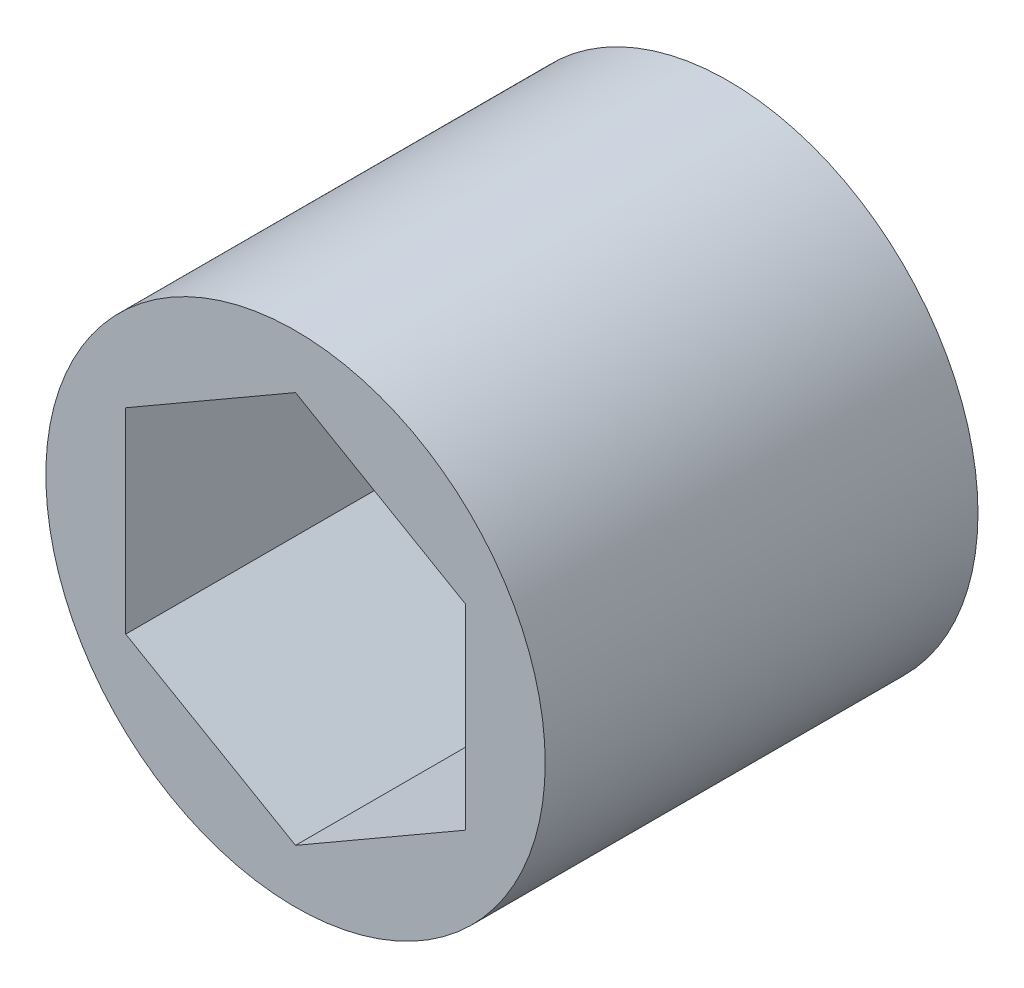
ISO-10303-21;
HEADER;
FILE_DESCRIPTION(('STEP AP214'),'2;1');
FILE_NAME('part.step','',(''),(''),'','','');
FILE_SCHEMA(('AUTOMOTIVE_DESIGN { 1 0 10303 214 1 1 1 1 }'));
ENDSEC;
DATA;
#1=APPLICATION_CONTEXT('core data for automotive mechanical design processes');
#2=APPLICATION_PROTOCOL_DEFINITION('international standard','automotive_design',2000,#1);
#3=PRODUCT_CONTEXT('',#1,'mechanical');
#4=PRODUCT('Part','Part','',(#3));
#5=PRODUCT_RELATED_PRODUCT_CATEGORY('part','',(#4));
#6=PRODUCT_DEFINITION_FORMATION('','',#4);
#7=PRODUCT_DEFINITION_CONTEXT('part definition',#1,'design');
#8=PRODUCT_DEFINITION('design','',#6,#7);
#9=PRODUCT_DEFINITION_SHAPE('','',#8);
#10=(LENGTH_UNIT() NAMED_UNIT(*) SI_UNIT(.MILLI.,.METRE.));
#11=(NAMED_UNIT(*) PLANE_ANGLE_UNIT() SI_UNIT($,.RADIAN.));
#12=(NAMED_UNIT(*) SI_UNIT($,.STERADIAN.) SOLID_ANGLE_UNIT());
#13=UNCERTAINTY_MEASURE_WITH_UNIT(LENGTH_MEASURE(1.E-05),#10,'distance_accuracy_value','');
#14=(GEOMETRIC_REPRESENTATION_CONTEXT(3) GLOBAL_UNCERTAINTY_ASSIGNED_CONTEXT((#13)) GLOBAL_UNIT_ASSIGNED_CONTEXT((#10,
#11,#12)) REPRESENTATION_CONTEXT('',''));
#15=CARTESIAN_POINT('',(0.,0.,0.));
#16=DIRECTION('',(0.,0.,1.));
#17=DIRECTION('',(1.,0.,0.));
#18=AXIS2_PLACEMENT_3D('',#15,#16,#17);
#19=CARTESIAN_POINT('',(0.,0.,8.255));
#20=DIRECTION('',(0.,0.,1.));
#21=DIRECTION('',(1.,0.,0.));
#22=AXIS2_PLACEMENT_3D('',#19,#20,#21);
#23=PLANE('',#22);
#24=CARTESIAN_POINT('',(0.,0.,8.255));
#25=DIRECTION('',(0.,0.,1.));
#26=DIRECTION('',(1.,0.,0.));
#27=AXIS2_PLACEMENT_3D('',#24,#25,#26);
#28=CIRCLE('',#27,9.525);
#29=CARTESIAN_POINT('',(9.525,0.,8.255));
#30=VERTEX_POINT('',#29);
#31=EDGE_CURVE('E11',#30,#30,#28,.T.);
#32=ORIENTED_EDGE('',*,*,#31,.T.);
#33=EDGE_LOOP('',(#32));
#34=FACE_BOUND('',#33,.T.);
#35=DIRECTION('',(-0.866025403784439,-0.5,0.));
#36=VECTOR('',#35,1.);
#37=CARTESIAN_POINT('',(0.,7.47899538708241,8.255));
#38=LINE('',#37,#36);
#39=CARTESIAN_POINT('',(0.,7.47899538708241,8.255));
#40=VERTEX_POINT('',#39);
#41=CARTESIAN_POINT('',(-6.477,3.73949769354121,8.255));
#42=VERTEX_POINT('',#41);
#43=EDGE_CURVE('E108',#40,#42,#38,.T.);
#44=ORIENTED_EDGE('',*,*,#43,.F.);
#45=DIRECTION('',(-0.866025403784439,0.5,0.));
#46=VECTOR('',#45,1.);
#47=CARTESIAN_POINT('',(6.477,3.73949769354121,8.255));
#48=LINE('',#47,#46);
#49=CARTESIAN_POINT('',(6.477,3.73949769354121,8.255));
#50=VERTEX_POINT('',#49);
#51=EDGE_CURVE('E99',#50,#40,#48,.T.);
#52=ORIENTED_EDGE('',*,*,#51,.F.);
#53=DIRECTION('',(0.,1.,0.));
#54=VECTOR('',#53,1.);
#55=CARTESIAN_POINT('',(6.47699999999999,-3.73949769354121,8.255));
#56=LINE('',#55,#54);
#57=CARTESIAN_POINT('',(6.47699999999999,-3.73949769354121,8.255));
#58=VERTEX_POINT('',#57);
#59=EDGE_CURVE('E133',#58,#50,#56,.T.);
#60=ORIENTED_EDGE('',*,*,#59,.F.);
#61=DIRECTION('',(0.866025403784439,0.5,0.));
#62=VECTOR('',#61,1.);
#63=CARTESIAN_POINT('',(0.,-7.47899538708241,8.255));
#64=LINE('',#63,#62);
#65=CARTESIAN_POINT('',(0.,-7.47899538708241,8.255));
#66=VERTEX_POINT('',#65);
#67=EDGE_CURVE('E130',#66,#58,#64,.T.);
#68=ORIENTED_EDGE('',*,*,#67,.F.);
#69=DIRECTION('',(0.866025403784438,-0.5,0.));
#70=VECTOR('',#69,1.);
#71=CARTESIAN_POINT('',(-6.477,-3.7394976935412,8.255));
#72=LINE('',#71,#70);
#73=CARTESIAN_POINT('',(-6.477,-3.7394976935412,8.255));
#74=VERTEX_POINT('',#73);
#75=EDGE_CURVE('E125',#74,#66,#72,.T.);
#76=ORIENTED_EDGE('',*,*,#75,.F.);
#77=DIRECTION('',(0.,-1.,0.));
#78=VECTOR('',#77,1.);
#79=CARTESIAN_POINT('',(-6.477,3.73949769354121,8.255));
#80=LINE('',#79,#78);
#81=EDGE_CURVE('E121',#42,#74,#80,.T.);
#82=ORIENTED_EDGE('',*,*,#81,.F.);
#83=EDGE_LOOP('',(#44,#52,#60,#68,#76,#82));
#84=FACE_BOUND('',#83,.T.);
#85=ADVANCED_FACE('F45',(#34,#84),#23,.T.);
#86=CARTESIAN_POINT('',(0.,0.,-8.255));
#87=DIRECTION('',(0.,0.,1.));
#88=DIRECTION('',(1.,0.,0.));
#89=AXIS2_PLACEMENT_3D('',#86,#87,#88);
#90=PLANE('',#89);
#91=CARTESIAN_POINT('',(0.,0.,-8.255));
#92=DIRECTION('',(0.,0.,1.));
#93=DIRECTION('',(1.,0.,0.));
#94=AXIS2_PLACEMENT_3D('',#91,#92,#93);
#95=CIRCLE('',#94,9.525);
#96=CARTESIAN_POINT('',(9.525,0.,-8.255));
#97=VERTEX_POINT('',#96);
#98=EDGE_CURVE('E49',#97,#97,#95,.T.);
#99=ORIENTED_EDGE('',*,*,#98,.F.);
#100=EDGE_LOOP('',(#99));
#101=FACE_BOUND('',#100,.T.);
#102=DIRECTION('',(-0.866025403784439,0.5,0.));
#103=VECTOR('',#102,1.);
#104=CARTESIAN_POINT('',(6.477,3.73949769354121,-8.255));
#105=LINE('',#104,#103);
#106=CARTESIAN_POINT('',(6.477,3.73949769354121,-8.255));
#107=VERTEX_POINT('',#106);
#108=CARTESIAN_POINT('',(0.,7.47899538708241,-8.255));
#109=VERTEX_POINT('',#108);
#110=EDGE_CURVE('E69',#107,#109,#105,.T.);
#111=ORIENTED_EDGE('',*,*,#110,.T.);
#112=DIRECTION('',(-0.866025403784439,-0.5,0.));
#113=VECTOR('',#112,1.);
#114=CARTESIAN_POINT('',(0.,7.47899538708241,-8.255));
#115=LINE('',#114,#113);
#116=CARTESIAN_POINT('',(-6.477,3.73949769354121,-8.255));
#117=VERTEX_POINT('',#116);
#118=EDGE_CURVE('E115',#109,#117,#115,.T.);
#119=ORIENTED_EDGE('',*,*,#118,.T.);
#120=DIRECTION('',(0.,-1.,0.));
#121=VECTOR('',#120,1.);
#122=CARTESIAN_POINT('',(-6.477,3.73949769354121,-8.255));
#123=LINE('',#122,#121);
#124=CARTESIAN_POINT('',(-6.477,-3.7394976935412,-8.255));
#125=VERTEX_POINT('',#124);
#126=EDGE_CURVE('E140',#117,#125,#123,.T.);
#127=ORIENTED_EDGE('',*,*,#126,.T.);
#128=DIRECTION('',(0.866025403784438,-0.5,0.));
#129=VECTOR('',#128,1.);
#130=CARTESIAN_POINT('',(-6.477,-3.7394976935412,-8.255));
#131=LINE('',#130,#129);
#132=CARTESIAN_POINT('',(0.,-7.47899538708241,-8.255));
#133=VERTEX_POINT('',#132);
#134=EDGE_CURVE('E144',#125,#133,#131,.T.);
#135=ORIENTED_EDGE('',*,*,#134,.T.);
#136=DIRECTION('',(0.866025403784439,0.5,0.));
#137=VECTOR('',#136,1.);
#138=CARTESIAN_POINT('',(0.,-7.47899538708241,-8.255));
#139=LINE('',#138,#137);
#140=CARTESIAN_POINT('',(6.47699999999999,-3.73949769354121,-8.255));
#141=VERTEX_POINT('',#140);
#142=EDGE_CURVE('E148',#133,#141,#139,.T.);
#143=ORIENTED_EDGE('',*,*,#142,.T.);
#144=DIRECTION('',(0.,1.,0.));
#145=VECTOR('',#144,1.);
#146=CARTESIAN_POINT('',(6.47699999999999,-3.73949769354121,-8.255));
#147=LINE('',#146,#145);
#148=EDGE_CURVE('E109',#141,#107,#147,.T.);
#149=ORIENTED_EDGE('',*,*,#148,.T.);
#150=EDGE_LOOP('',(#111,#119,#127,#135,#143,#149));
#151=FACE_BOUND('',#150,.T.);
#152=ADVANCED_FACE('F172',(#101,#151),#90,.F.);
#153=CARTESIAN_POINT('',(0.,0.,8.255));
#154=DIRECTION('',(0.,0.,-1.));
#155=DIRECTION('',(-1.,0.,0.));
#156=AXIS2_PLACEMENT_3D('',#153,#154,#155);
#157=CYLINDRICAL_SURFACE('',#156,9.525);
#158=ORIENTED_EDGE('',*,*,#31,.F.);
#159=EDGE_LOOP('',(#158));
#160=FACE_BOUND('',#159,.T.);
#161=ORIENTED_EDGE('',*,*,#98,.T.);
#162=EDGE_LOOP('',(#161));
#163=FACE_BOUND('',#162,.T.);
#164=ADVANCED_FACE('F47',(#160,#163),#157,.T.);
#165=CARTESIAN_POINT('',(6.477,3.73949769354121,8.255));
#166=DIRECTION('',(-0.5,-0.866025403784439,0.));
#167=DIRECTION('',(0.866025403784439,-0.5,0.));
#168=AXIS2_PLACEMENT_3D('',#165,#166,#167);
#169=PLANE('',#168);
#170=ORIENTED_EDGE('',*,*,#110,.F.);
#171=DIRECTION('',(0.,0.,-1.));
#172=VECTOR('',#171,1.);
#173=CARTESIAN_POINT('',(6.477,3.73949769354121,8.255));
#174=LINE('',#173,#172);
#175=EDGE_CURVE('E103',#50,#107,#174,.T.);
#176=ORIENTED_EDGE('',*,*,#175,.F.);
#177=ORIENTED_EDGE('',*,*,#51,.T.);
#178=DIRECTION('',(0.,0.,-1.));
#179=VECTOR('',#178,1.);
#180=CARTESIAN_POINT('',(0.,7.47899538708241,8.255));
#181=LINE('',#180,#179);
#182=EDGE_CURVE('E102',#40,#109,#181,.T.);
#183=ORIENTED_EDGE('',*,*,#182,.T.);
#184=EDGE_LOOP('',(#170,#176,#177,#183));
#185=FACE_BOUND('',#184,.T.);
#186=ADVANCED_FACE('F101',(#185),#169,.T.);
#187=CARTESIAN_POINT('',(0.,7.47899538708241,8.255));
#188=DIRECTION('',(0.5,-0.866025403784439,0.));
#189=DIRECTION('',(0.866025403784439,0.5,0.));
#190=AXIS2_PLACEMENT_3D('',#187,#188,#189);
#191=PLANE('',#190);
#192=ORIENTED_EDGE('',*,*,#118,.F.);
#193=ORIENTED_EDGE('',*,*,#182,.F.);
#194=ORIENTED_EDGE('',*,*,#43,.T.);
#195=DIRECTION('',(0.,0.,-1.));
#196=VECTOR('',#195,1.);
#197=CARTESIAN_POINT('',(-6.477,3.73949769354121,8.255));
#198=LINE('',#197,#196);
#199=EDGE_CURVE('E117',#42,#117,#198,.T.);
#200=ORIENTED_EDGE('',*,*,#199,.T.);
#201=EDGE_LOOP('',(#192,#193,#194,#200));
#202=FACE_BOUND('',#201,.T.);
#203=ADVANCED_FACE('F112',(#202),#191,.T.);
#204=CARTESIAN_POINT('',(-6.477,3.73949769354121,8.255));
#205=DIRECTION('',(1.,0.,0.));
#206=DIRECTION('',(0.,1.,0.));
#207=AXIS2_PLACEMENT_3D('',#204,#205,#206);
#208=PLANE('',#207);
#209=ORIENTED_EDGE('',*,*,#126,.F.);
#210=ORIENTED_EDGE('',*,*,#199,.F.);
#211=ORIENTED_EDGE('',*,*,#81,.T.);
#212=DIRECTION('',(0.,0.,-1.));
#213=VECTOR('',#212,1.);
#214=CARTESIAN_POINT('',(-6.477,-3.7394976935412,8.255));
#215=LINE('',#214,#213);
#216=EDGE_CURVE('E162',#74,#125,#215,.T.);
#217=ORIENTED_EDGE('',*,*,#216,.T.);
#218=EDGE_LOOP('',(#209,#210,#211,#217));
#219=FACE_BOUND('',#218,.T.);
#220=ADVANCED_FACE('F168',(#219),#208,.T.);
#221=CARTESIAN_POINT('',(-6.477,-3.7394976935412,8.255));
#222=DIRECTION('',(0.5,0.866025403784439,0.));
#223=DIRECTION('',(-0.866025403784439,0.5,0.));
#224=AXIS2_PLACEMENT_3D('',#221,#222,#223);
#225=PLANE('',#224);
#226=ORIENTED_EDGE('',*,*,#134,.F.);
#227=ORIENTED_EDGE('',*,*,#216,.F.);
#228=ORIENTED_EDGE('',*,*,#75,.T.);
#229=DIRECTION('',(0.,0.,-1.));
#230=VECTOR('',#229,1.);
#231=CARTESIAN_POINT('',(0.,-7.47899538708241,8.255));
#232=LINE('',#231,#230);
#233=EDGE_CURVE('E159',#66,#133,#232,.T.);
#234=ORIENTED_EDGE('',*,*,#233,.T.);
#235=EDGE_LOOP('',(#226,#227,#228,#234));
#236=FACE_BOUND('',#235,.T.);
#237=ADVANCED_FACE('F180',(#236),#225,.T.);
#238=CARTESIAN_POINT('',(0.,-7.47899538708241,8.255));
#239=DIRECTION('',(-0.5,0.866025403784439,0.));
#240=DIRECTION('',(-0.866025403784439,-0.5,0.));
#241=AXIS2_PLACEMENT_3D('',#238,#239,#240);
#242=PLANE('',#241);
#243=ORIENTED_EDGE('',*,*,#142,.F.);
#244=ORIENTED_EDGE('',*,*,#233,.F.);
#245=ORIENTED_EDGE('',*,*,#67,.T.);
#246=DIRECTION('',(0.,0.,-1.));
#247=VECTOR('',#246,1.);
#248=CARTESIAN_POINT('',(6.47699999999999,-3.73949769354121,8.255));
#249=LINE('',#248,#247);
#250=EDGE_CURVE('E61',#58,#141,#249,.T.);
#251=ORIENTED_EDGE('',*,*,#250,.T.);
#252=EDGE_LOOP('',(#243,#244,#245,#251));
#253=FACE_BOUND('',#252,.T.);
#254=ADVANCED_FACE('F178',(#253),#242,.T.);
#255=CARTESIAN_POINT('',(6.47699999999999,-3.73949769354121,8.255));
#256=DIRECTION('',(-1.,0.,0.));
#257=DIRECTION('',(0.,-1.,0.));
#258=AXIS2_PLACEMENT_3D('',#255,#256,#257);
#259=PLANE('',#258);
#260=ORIENTED_EDGE('',*,*,#148,.F.);
#261=ORIENTED_EDGE('',*,*,#250,.F.);
#262=ORIENTED_EDGE('',*,*,#59,.T.);
#263=ORIENTED_EDGE('',*,*,#175,.T.);
#264=EDGE_LOOP('',(#260,#261,#262,#263));
#265=FACE_BOUND('',#264,.T.);
#266=ADVANCED_FACE('F174',(#265),#259,.T.);
#267=CLOSED_SHELL('',(#85,#152,#164,#186,#203,#220,#237,#254,#266));
#268=MANIFOLD_SOLID_BREP('B2',#267);
#269=ADVANCED_BREP_SHAPE_REPRESENTATION('',(#18,#268),#14);
#270=SHAPE_DEFINITION_REPRESENTATION(#9,#269);
ENDSEC;
END-ISO-10303-21;
